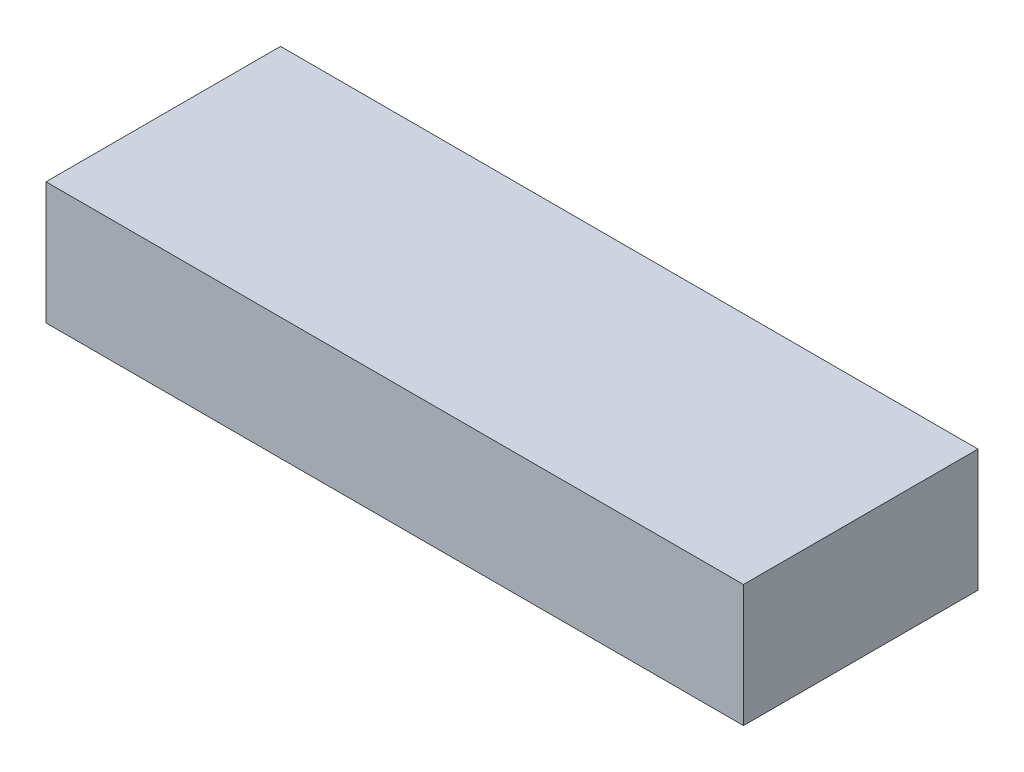
ISO-10303-21;
HEADER;
FILE_DESCRIPTION(('STEP AP214'),'2;1');
FILE_NAME('part.step','',(''),(''),'','','');
FILE_SCHEMA(('AUTOMOTIVE_DESIGN { 1 0 10303 214 1 1 1 1 }'));
ENDSEC;
DATA;
#1=APPLICATION_CONTEXT('core data for automotive mechanical design processes');
#2=APPLICATION_PROTOCOL_DEFINITION('international standard','automotive_design',2000,#1);
#3=PRODUCT_CONTEXT('',#1,'mechanical');
#4=PRODUCT('Part','Part','',(#3));
#5=PRODUCT_RELATED_PRODUCT_CATEGORY('part','',(#4));
#6=PRODUCT_DEFINITION_FORMATION('','',#4);
#7=PRODUCT_DEFINITION_CONTEXT('part definition',#1,'design');
#8=PRODUCT_DEFINITION('design','',#6,#7);
#9=PRODUCT_DEFINITION_SHAPE('','',#8);
#10=(LENGTH_UNIT() NAMED_UNIT(*) SI_UNIT(.MILLI.,.METRE.));
#11=(NAMED_UNIT(*) PLANE_ANGLE_UNIT() SI_UNIT($,.RADIAN.));
#12=(NAMED_UNIT(*) SI_UNIT($,.STERADIAN.) SOLID_ANGLE_UNIT());
#13=UNCERTAINTY_MEASURE_WITH_UNIT(LENGTH_MEASURE(1.E-05),#10,'distance_accuracy_value','');
#14=(GEOMETRIC_REPRESENTATION_CONTEXT(3) GLOBAL_UNCERTAINTY_ASSIGNED_CONTEXT((#13)) GLOBAL_UNIT_ASSIGNED_CONTEXT((#10,
#11,#12)) REPRESENTATION_CONTEXT('',''));
#15=CARTESIAN_POINT('',(0.,0.,0.));
#16=DIRECTION('',(0.,0.,1.));
#17=DIRECTION('',(1.,0.,0.));
#18=AXIS2_PLACEMENT_3D('',#15,#16,#17);
#19=CARTESIAN_POINT('',(0.,10.,0.));
#20=DIRECTION('',(0.,0.,-1.));
#21=DIRECTION('',(-1.,0.,0.));
#22=AXIS2_PLACEMENT_3D('',#19,#20,#21);
#23=PLANE('',#22);
#24=DIRECTION('',(1.,0.,0.));
#25=VECTOR('',#24,1.);
#26=CARTESIAN_POINT('',(0.,0.,0.));
#27=LINE('',#26,#25);
#28=CARTESIAN_POINT('',(0.,0.,0.));
#29=VERTEX_POINT('',#28);
#30=CARTESIAN_POINT('',(57.059703514619,0.,0.));
#31=VERTEX_POINT('',#30);
#32=EDGE_CURVE('E98',#29,#31,#27,.T.);
#33=ORIENTED_EDGE('',*,*,#32,.T.);
#34=DIRECTION('',(0.,-1.,0.));
#35=VECTOR('',#34,1.);
#36=CARTESIAN_POINT('',(57.059703514619,10.,0.));
#37=LINE('',#36,#35);
#38=CARTESIAN_POINT('',(57.059703514619,10.,0.));
#39=VERTEX_POINT('',#38);
#40=EDGE_CURVE('E11',#39,#31,#37,.T.);
#41=ORIENTED_EDGE('',*,*,#40,.F.);
#42=DIRECTION('',(1.,0.,0.));
#43=VECTOR('',#42,1.);
#44=CARTESIAN_POINT('',(0.,10.,0.));
#45=LINE('',#44,#43);
#46=CARTESIAN_POINT('',(0.,10.,0.));
#47=VERTEX_POINT('',#46);
#48=EDGE_CURVE('E84',#47,#39,#45,.T.);
#49=ORIENTED_EDGE('',*,*,#48,.F.);
#50=DIRECTION('',(0.,-1.,0.));
#51=VECTOR('',#50,1.);
#52=CARTESIAN_POINT('',(0.,10.,0.));
#53=LINE('',#52,#51);
#54=EDGE_CURVE('E51',#47,#29,#53,.T.);
#55=ORIENTED_EDGE('',*,*,#54,.T.);
#56=EDGE_LOOP('',(#33,#41,#49,#55));
#57=FACE_BOUND('',#56,.T.);
#58=ADVANCED_FACE('F35',(#57),#23,.F.);
#59=CARTESIAN_POINT('',(57.059703514619,10.,0.));
#60=DIRECTION('',(-1.,0.,0.));
#61=DIRECTION('',(0.,0.,1.));
#62=AXIS2_PLACEMENT_3D('',#59,#60,#61);
#63=PLANE('',#62);
#64=DIRECTION('',(0.,0.,-1.));
#65=VECTOR('',#64,1.);
#66=CARTESIAN_POINT('',(57.059703514619,0.,0.));
#67=LINE('',#66,#65);
#68=CARTESIAN_POINT('',(57.059703514619,0.,-19.1862826299328));
#69=VERTEX_POINT('',#68);
#70=EDGE_CURVE('E89',#31,#69,#67,.T.);
#71=ORIENTED_EDGE('',*,*,#70,.T.);
#72=DIRECTION('',(0.,-1.,0.));
#73=VECTOR('',#72,1.);
#74=CARTESIAN_POINT('',(57.059703514619,10.,-19.1862826299328));
#75=LINE('',#74,#73);
#76=CARTESIAN_POINT('',(57.059703514619,10.,-19.1862826299328));
#77=VERTEX_POINT('',#76);
#78=EDGE_CURVE('E43',#77,#69,#75,.T.);
#79=ORIENTED_EDGE('',*,*,#78,.F.);
#80=DIRECTION('',(0.,0.,-1.));
#81=VECTOR('',#80,1.);
#82=CARTESIAN_POINT('',(57.059703514619,10.,0.));
#83=LINE('',#82,#81);
#84=EDGE_CURVE('E76',#39,#77,#83,.T.);
#85=ORIENTED_EDGE('',*,*,#84,.F.);
#86=ORIENTED_EDGE('',*,*,#40,.T.);
#87=EDGE_LOOP('',(#71,#79,#85,#86));
#88=FACE_BOUND('',#87,.T.);
#89=ADVANCED_FACE('F88',(#88),#63,.F.);
#90=CARTESIAN_POINT('',(0.,10.,-19.1862826299328));
#91=DIRECTION('',(0.,0.,-1.));
#92=DIRECTION('',(-1.,0.,0.));
#93=AXIS2_PLACEMENT_3D('',#90,#91,#92);
#94=PLANE('',#93);
#95=DIRECTION('',(1.,0.,0.));
#96=VECTOR('',#95,1.);
#97=CARTESIAN_POINT('',(0.,0.,-19.1862826299328));
#98=LINE('',#97,#96);
#99=CARTESIAN_POINT('',(0.,0.,-19.1862826299328));
#100=VERTEX_POINT('',#99);
#101=EDGE_CURVE('E101',#100,#69,#98,.T.);
#102=ORIENTED_EDGE('',*,*,#101,.F.);
#103=DIRECTION('',(0.,-1.,0.));
#104=VECTOR('',#103,1.);
#105=CARTESIAN_POINT('',(0.,10.,-19.1862826299328));
#106=LINE('',#105,#104);
#107=CARTESIAN_POINT('',(0.,10.,-19.1862826299328));
#108=VERTEX_POINT('',#107);
#109=EDGE_CURVE('E65',#108,#100,#106,.T.);
#110=ORIENTED_EDGE('',*,*,#109,.F.);
#111=DIRECTION('',(1.,0.,0.));
#112=VECTOR('',#111,1.);
#113=CARTESIAN_POINT('',(0.,10.,-19.1862826299328));
#114=LINE('',#113,#112);
#115=EDGE_CURVE('E83',#108,#77,#114,.T.);
#116=ORIENTED_EDGE('',*,*,#115,.T.);
#117=ORIENTED_EDGE('',*,*,#78,.T.);
#118=EDGE_LOOP('',(#102,#110,#116,#117));
#119=FACE_BOUND('',#118,.T.);
#120=ADVANCED_FACE('F92',(#119),#94,.T.);
#121=CARTESIAN_POINT('',(0.,10.,0.));
#122=DIRECTION('',(-1.,0.,0.));
#123=DIRECTION('',(0.,0.,1.));
#124=AXIS2_PLACEMENT_3D('',#121,#122,#123);
#125=PLANE('',#124);
#126=DIRECTION('',(0.,0.,-1.));
#127=VECTOR('',#126,1.);
#128=CARTESIAN_POINT('',(0.,0.,0.));
#129=LINE('',#128,#127);
#130=EDGE_CURVE('E103',#29,#100,#129,.T.);
#131=ORIENTED_EDGE('',*,*,#130,.F.);
#132=ORIENTED_EDGE('',*,*,#54,.F.);
#133=DIRECTION('',(0.,0.,-1.));
#134=VECTOR('',#133,1.);
#135=CARTESIAN_POINT('',(0.,10.,0.));
#136=LINE('',#135,#134);
#137=EDGE_CURVE('E93',#47,#108,#136,.T.);
#138=ORIENTED_EDGE('',*,*,#137,.T.);
#139=ORIENTED_EDGE('',*,*,#109,.T.);
#140=EDGE_LOOP('',(#131,#132,#138,#139));
#141=FACE_BOUND('',#140,.T.);
#142=ADVANCED_FACE('F109',(#141),#125,.T.);
#143=CARTESIAN_POINT('',(0.,10.,0.));
#144=DIRECTION('',(0.,1.,0.));
#145=DIRECTION('',(0.,0.,1.));
#146=AXIS2_PLACEMENT_3D('',#143,#144,#145);
#147=PLANE('',#146);
#148=ORIENTED_EDGE('',*,*,#48,.T.);
#149=ORIENTED_EDGE('',*,*,#84,.T.);
#150=ORIENTED_EDGE('',*,*,#115,.F.);
#151=ORIENTED_EDGE('',*,*,#137,.F.);
#152=EDGE_LOOP('',(#148,#149,#150,#151));
#153=FACE_BOUND('',#152,.T.);
#154=ADVANCED_FACE('F80',(#153),#147,.T.);
#155=CARTESIAN_POINT('',(0.,0.,0.));
#156=DIRECTION('',(0.,1.,0.));
#157=DIRECTION('',(0.,0.,1.));
#158=AXIS2_PLACEMENT_3D('',#155,#156,#157);
#159=PLANE('',#158);
#160=ORIENTED_EDGE('',*,*,#32,.F.);
#161=ORIENTED_EDGE('',*,*,#130,.T.);
#162=ORIENTED_EDGE('',*,*,#101,.T.);
#163=ORIENTED_EDGE('',*,*,#70,.F.);
#164=EDGE_LOOP('',(#160,#161,#162,#163));
#165=FACE_BOUND('',#164,.T.);
#166=ADVANCED_FACE('F108',(#165),#159,.F.);
#167=CLOSED_SHELL('',(#58,#89,#120,#142,#154,#166));
#168=MANIFOLD_SOLID_BREP('B2',#167);
#169=ADVANCED_BREP_SHAPE_REPRESENTATION('',(#18,#168),#14);
#170=SHAPE_DEFINITION_REPRESENTATION(#9,#169);
ENDSEC;
END-ISO-10303-21;
